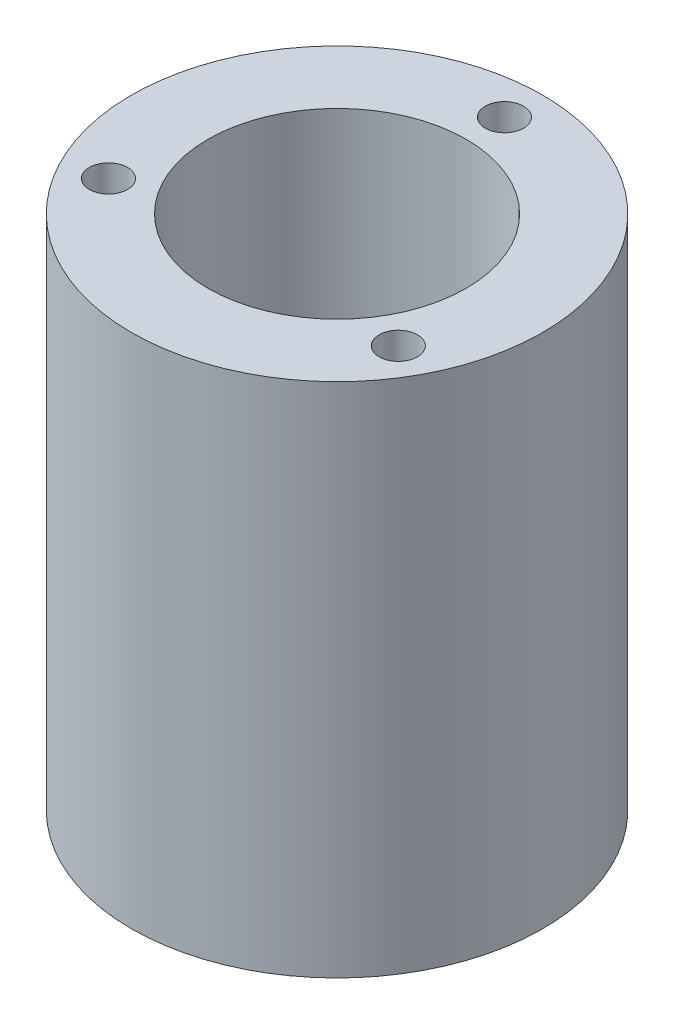
ISO-10303-21;
HEADER;
FILE_DESCRIPTION(('STEP AP214'),'2;1');
FILE_NAME('part.step','',(''),(''),'','','');
FILE_SCHEMA(('AUTOMOTIVE_DESIGN { 1 0 10303 214 1 1 1 1 }'));
ENDSEC;
DATA;
#1=APPLICATION_CONTEXT('core data for automotive mechanical design processes');
#2=APPLICATION_PROTOCOL_DEFINITION('international standard','automotive_design',2000,#1);
#3=PRODUCT_CONTEXT('',#1,'mechanical');
#4=PRODUCT('Part','Part','',(#3));
#5=PRODUCT_RELATED_PRODUCT_CATEGORY('part','',(#4));
#6=PRODUCT_DEFINITION_FORMATION('','',#4);
#7=PRODUCT_DEFINITION_CONTEXT('part definition',#1,'design');
#8=PRODUCT_DEFINITION('design','',#6,#7);
#9=PRODUCT_DEFINITION_SHAPE('','',#8);
#10=(LENGTH_UNIT() NAMED_UNIT(*) SI_UNIT(.MILLI.,.METRE.));
#11=(NAMED_UNIT(*) PLANE_ANGLE_UNIT() SI_UNIT($,.RADIAN.));
#12=(NAMED_UNIT(*) SI_UNIT($,.STERADIAN.) SOLID_ANGLE_UNIT());
#13=UNCERTAINTY_MEASURE_WITH_UNIT(LENGTH_MEASURE(1.E-05),#10,'distance_accuracy_value','');
#14=(GEOMETRIC_REPRESENTATION_CONTEXT(3) GLOBAL_UNCERTAINTY_ASSIGNED_CONTEXT((#13)) GLOBAL_UNIT_ASSIGNED_CONTEXT((#10,
#11,#12)) REPRESENTATION_CONTEXT('',''));
#15=CARTESIAN_POINT('',(0.,0.,0.));
#16=DIRECTION('',(0.,0.,1.));
#17=DIRECTION('',(1.,0.,0.));
#18=AXIS2_PLACEMENT_3D('',#15,#16,#17);
#19=CARTESIAN_POINT('',(0.,4.,0.));
#20=DIRECTION('',(0.,-1.,0.));
#21=DIRECTION('',(0.,0.,-1.));
#22=AXIS2_PLACEMENT_3D('',#19,#20,#21);
#23=CYLINDRICAL_SURFACE('',#22,21.5);
#24=CARTESIAN_POINT('',(0.,0.,0.));
#25=DIRECTION('',(0.,1.,0.));
#26=DIRECTION('',(0.,0.,1.));
#27=AXIS2_PLACEMENT_3D('',#24,#25,#26);
#28=CIRCLE('',#27,21.5);
#29=CARTESIAN_POINT('',(0.,0.,21.5));
#30=VERTEX_POINT('',#29);
#31=EDGE_CURVE('E47',#30,#30,#28,.T.);
#32=ORIENTED_EDGE('',*,*,#31,.T.);
#33=EDGE_LOOP('',(#32));
#34=FACE_BOUND('',#33,.T.);
#35=CARTESIAN_POINT('',(0.,54.,0.));
#36=DIRECTION('',(0.,1.,0.));
#37=DIRECTION('',(0.,0.,1.));
#38=AXIS2_PLACEMENT_3D('',#35,#36,#37);
#39=CIRCLE('',#38,21.5);
#40=CARTESIAN_POINT('',(0.,54.,21.5));
#41=VERTEX_POINT('',#40);
#42=EDGE_CURVE('E153',#41,#41,#39,.T.);
#43=ORIENTED_EDGE('',*,*,#42,.F.);
#44=EDGE_LOOP('',(#43));
#45=FACE_BOUND('',#44,.T.);
#46=ADVANCED_FACE('F39',(#34,#45),#23,.T.);
#47=CARTESIAN_POINT('',(0.,0.,0.));
#48=DIRECTION('',(0.,1.,0.));
#49=DIRECTION('',(0.,0.,1.));
#50=AXIS2_PLACEMENT_3D('',#47,#48,#49);
#51=PLANE('',#50);
#52=DIRECTION('',(1.,0.,0.));
#53=VECTOR('',#52,1.);
#54=CARTESIAN_POINT('',(-1.5,0.,-1.5));
#55=LINE('',#54,#53);
#56=CARTESIAN_POINT('',(-1.5,0.,-1.5));
#57=VERTEX_POINT('',#56);
#58=CARTESIAN_POINT('',(1.5,0.,-1.5));
#59=VERTEX_POINT('',#58);
#60=EDGE_CURVE('E104',#57,#59,#55,.T.);
#61=ORIENTED_EDGE('',*,*,#60,.F.);
#62=DIRECTION('',(0.,0.,-1.));
#63=VECTOR('',#62,1.);
#64=CARTESIAN_POINT('',(-1.5,0.,-1.5));
#65=LINE('',#64,#63);
#66=CARTESIAN_POINT('',(-1.5,0.,1.5));
#67=VERTEX_POINT('',#66);
#68=EDGE_CURVE('E54',#67,#57,#65,.T.);
#69=ORIENTED_EDGE('',*,*,#68,.F.);
#70=DIRECTION('',(-1.,0.,0.));
#71=VECTOR('',#70,1.);
#72=CARTESIAN_POINT('',(-1.5,0.,1.5));
#73=LINE('',#72,#71);
#74=CARTESIAN_POINT('',(1.5,0.,1.5));
#75=VERTEX_POINT('',#74);
#76=EDGE_CURVE('E94',#75,#67,#73,.T.);
#77=ORIENTED_EDGE('',*,*,#76,.F.);
#78=DIRECTION('',(0.,0.,1.));
#79=VECTOR('',#78,1.);
#80=CARTESIAN_POINT('',(1.5,0.,-1.5));
#81=LINE('',#80,#79);
#82=EDGE_CURVE('E112',#59,#75,#81,.T.);
#83=ORIENTED_EDGE('',*,*,#82,.F.);
#84=EDGE_LOOP('',(#61,#69,#77,#83));
#85=FACE_BOUND('',#84,.T.);
#86=ORIENTED_EDGE('',*,*,#31,.F.);
#87=EDGE_LOOP('',(#86));
#88=FACE_BOUND('',#87,.T.);
#89=ADVANCED_FACE('F162',(#85,#88),#51,.F.);
#90=CARTESIAN_POINT('',(0.,54.,0.));
#91=DIRECTION('',(0.,1.,0.));
#92=DIRECTION('',(0.,0.,1.));
#93=AXIS2_PLACEMENT_3D('',#90,#91,#92);
#94=PLANE('',#93);
#95=CARTESIAN_POINT('',(-15.1554445662276,54.,8.75000000000007));
#96=DIRECTION('',(0.,1.,0.));
#97=DIRECTION('',(0.866025403784436,0.,-0.500000000000004));
#98=AXIS2_PLACEMENT_3D('',#95,#96,#97);
#99=CIRCLE('',#98,2.);
#100=CARTESIAN_POINT('',(-13.4233937586588,54.,7.75000000000006));
#101=VERTEX_POINT('',#100);
#102=EDGE_CURVE('E131',#101,#101,#99,.T.);
#103=ORIENTED_EDGE('',*,*,#102,.F.);
#104=EDGE_LOOP('',(#103));
#105=FACE_BOUND('',#104,.T.);
#106=CARTESIAN_POINT('',(15.1554445662278,54.,8.74999999999986));
#107=DIRECTION('',(0.,1.,0.));
#108=DIRECTION('',(-0.866025403784443,0.,-0.499999999999992));
#109=AXIS2_PLACEMENT_3D('',#106,#107,#108);
#110=CIRCLE('',#109,2.);
#111=CARTESIAN_POINT('',(13.4233937586589,54.,7.74999999999988));
#112=VERTEX_POINT('',#111);
#113=EDGE_CURVE('E87',#112,#112,#110,.T.);
#114=ORIENTED_EDGE('',*,*,#113,.F.);
#115=EDGE_LOOP('',(#114));
#116=FACE_BOUND('',#115,.T.);
#117=CARTESIAN_POINT('',(0.,54.,-17.5));
#118=DIRECTION('',(0.,1.,0.));
#119=DIRECTION('',(0.,0.,1.));
#120=AXIS2_PLACEMENT_3D('',#117,#118,#119);
#121=CIRCLE('',#120,2.);
#122=CARTESIAN_POINT('',(0.,54.,-15.5));
#123=VERTEX_POINT('',#122);
#124=EDGE_CURVE('E130',#123,#123,#121,.T.);
#125=ORIENTED_EDGE('',*,*,#124,.F.);
#126=EDGE_LOOP('',(#125));
#127=FACE_BOUND('',#126,.T.);
#128=ORIENTED_EDGE('',*,*,#42,.T.);
#129=EDGE_LOOP('',(#128));
#130=FACE_BOUND('',#129,.T.);
#131=CARTESIAN_POINT('',(0.,54.,0.));
#132=DIRECTION('',(0.,1.,0.));
#133=DIRECTION('',(0.,0.,1.));
#134=AXIS2_PLACEMENT_3D('',#131,#132,#133);
#135=CIRCLE('',#134,13.5);
#136=CARTESIAN_POINT('',(0.,54.,13.5));
#137=VERTEX_POINT('',#136);
#138=EDGE_CURVE('E146',#137,#137,#135,.T.);
#139=ORIENTED_EDGE('',*,*,#138,.F.);
#140=EDGE_LOOP('',(#139));
#141=FACE_BOUND('',#140,.T.);
#142=ADVANCED_FACE('F164',(#105,#116,#127,#130,#141),#94,.T.);
#143=CARTESIAN_POINT('',(0.,54.,0.));
#144=DIRECTION('',(0.,-1.,0.));
#145=DIRECTION('',(0.,0.,-1.));
#146=AXIS2_PLACEMENT_3D('',#143,#144,#145);
#147=CYLINDRICAL_SURFACE('',#146,13.5);
#148=ORIENTED_EDGE('',*,*,#138,.T.);
#149=EDGE_LOOP('',(#148));
#150=FACE_BOUND('',#149,.T.);
#151=CARTESIAN_POINT('',(0.,4.,0.));
#152=DIRECTION('',(0.,1.,0.));
#153=DIRECTION('',(0.,0.,1.));
#154=AXIS2_PLACEMENT_3D('',#151,#152,#153);
#155=CIRCLE('',#154,13.5);
#156=CARTESIAN_POINT('',(0.,4.,13.5));
#157=VERTEX_POINT('',#156);
#158=EDGE_CURVE('E11',#157,#157,#155,.F.);
#159=ORIENTED_EDGE('',*,*,#158,.T.);
#160=EDGE_LOOP('',(#159));
#161=FACE_BOUND('',#160,.T.);
#162=ADVANCED_FACE('F170',(#150,#161),#147,.F.);
#163=CARTESIAN_POINT('',(0.,4.,0.));
#164=DIRECTION('',(0.,1.,0.));
#165=DIRECTION('',(0.,0.,1.));
#166=AXIS2_PLACEMENT_3D('',#163,#164,#165);
#167=PLANE('',#166);
#168=DIRECTION('',(0.,0.,-1.));
#169=VECTOR('',#168,1.);
#170=CARTESIAN_POINT('',(-1.5,4.,-1.5));
#171=LINE('',#170,#169);
#172=CARTESIAN_POINT('',(-1.5,4.,1.5));
#173=VERTEX_POINT('',#172);
#174=CARTESIAN_POINT('',(-1.5,4.,-1.5));
#175=VERTEX_POINT('',#174);
#176=EDGE_CURVE('E91',#173,#175,#171,.T.);
#177=ORIENTED_EDGE('',*,*,#176,.T.);
#178=DIRECTION('',(1.,0.,0.));
#179=VECTOR('',#178,1.);
#180=CARTESIAN_POINT('',(-1.5,4.,-1.5));
#181=LINE('',#180,#179);
#182=CARTESIAN_POINT('',(1.5,4.,-1.5));
#183=VERTEX_POINT('',#182);
#184=EDGE_CURVE('E79',#175,#183,#181,.T.);
#185=ORIENTED_EDGE('',*,*,#184,.T.);
#186=DIRECTION('',(0.,0.,1.));
#187=VECTOR('',#186,1.);
#188=CARTESIAN_POINT('',(1.5,4.,-1.5));
#189=LINE('',#188,#187);
#190=CARTESIAN_POINT('',(1.5,4.,1.5));
#191=VERTEX_POINT('',#190);
#192=EDGE_CURVE('E106',#183,#191,#189,.T.);
#193=ORIENTED_EDGE('',*,*,#192,.T.);
#194=DIRECTION('',(-1.,0.,0.));
#195=VECTOR('',#194,1.);
#196=CARTESIAN_POINT('',(-1.5,4.,1.5));
#197=LINE('',#196,#195);
#198=EDGE_CURVE('E99',#191,#173,#197,.T.);
#199=ORIENTED_EDGE('',*,*,#198,.T.);
#200=EDGE_LOOP('',(#177,#185,#193,#199));
#201=FACE_BOUND('',#200,.T.);
#202=ORIENTED_EDGE('',*,*,#158,.F.);
#203=EDGE_LOOP('',(#202));
#204=FACE_BOUND('',#203,.T.);
#205=ADVANCED_FACE('F97',(#201,#204),#167,.T.);
#206=CARTESIAN_POINT('',(0.,48.,-17.5));
#207=DIRECTION('',(0.,1.,0.));
#208=DIRECTION('',(0.,0.,1.));
#209=AXIS2_PLACEMENT_3D('',#206,#207,#208);
#210=CYLINDRICAL_SURFACE('',#209,2.);
#211=CARTESIAN_POINT('',(0.,48.,-17.5));
#212=DIRECTION('',(0.,1.,0.));
#213=DIRECTION('',(0.,0.,1.));
#214=AXIS2_PLACEMENT_3D('',#211,#212,#213);
#215=CIRCLE('',#214,2.);
#216=CARTESIAN_POINT('',(0.,48.,-15.5));
#217=VERTEX_POINT('',#216);
#218=EDGE_CURVE('E142',#217,#217,#215,.T.);
#219=ORIENTED_EDGE('',*,*,#218,.F.);
#220=EDGE_LOOP('',(#219));
#221=FACE_BOUND('',#220,.T.);
#222=ORIENTED_EDGE('',*,*,#124,.T.);
#223=EDGE_LOOP('',(#222));
#224=FACE_BOUND('',#223,.T.);
#225=ADVANCED_FACE('F175',(#221,#224),#210,.F.);
#226=CARTESIAN_POINT('',(0.,48.,-17.5));
#227=DIRECTION('',(0.,1.,0.));
#228=DIRECTION('',(0.,0.,1.));
#229=AXIS2_PLACEMENT_3D('',#226,#227,#228);
#230=PLANE('',#229);
#231=ORIENTED_EDGE('',*,*,#218,.T.);
#232=EDGE_LOOP('',(#231));
#233=FACE_BOUND('',#232,.T.);
#234=ADVANCED_FACE('F182',(#233),#230,.T.);
#235=CARTESIAN_POINT('',(15.1554445662278,48.,8.74999999999986));
#236=DIRECTION('',(0.,1.,0.));
#237=DIRECTION('',(0.,0.,1.));
#238=AXIS2_PLACEMENT_3D('',#235,#236,#237);
#239=CYLINDRICAL_SURFACE('',#238,2.);
#240=CARTESIAN_POINT('',(15.1554445662278,48.,8.74999999999986));
#241=DIRECTION('',(0.,1.,0.));
#242=DIRECTION('',(-0.866025403784443,0.,-0.499999999999992));
#243=AXIS2_PLACEMENT_3D('',#240,#241,#242);
#244=CIRCLE('',#243,2.);
#245=CARTESIAN_POINT('',(13.4233937586589,48.,7.74999999999988));
#246=VERTEX_POINT('',#245);
#247=EDGE_CURVE('E135',#246,#246,#244,.T.);
#248=ORIENTED_EDGE('',*,*,#247,.F.);
#249=EDGE_LOOP('',(#248));
#250=FACE_BOUND('',#249,.T.);
#251=ORIENTED_EDGE('',*,*,#113,.T.);
#252=EDGE_LOOP('',(#251));
#253=FACE_BOUND('',#252,.T.);
#254=ADVANCED_FACE('F186',(#250,#253),#239,.F.);
#255=CARTESIAN_POINT('',(15.1554445662278,48.,8.74999999999986));
#256=DIRECTION('',(0.,1.,0.));
#257=DIRECTION('',(-0.866025403784443,0.,-0.499999999999992));
#258=AXIS2_PLACEMENT_3D('',#255,#256,#257);
#259=PLANE('',#258);
#260=ORIENTED_EDGE('',*,*,#247,.T.);
#261=EDGE_LOOP('',(#260));
#262=FACE_BOUND('',#261,.T.);
#263=ADVANCED_FACE('F190',(#262),#259,.T.);
#264=CARTESIAN_POINT('',(-15.1554445662276,48.,8.75000000000007));
#265=DIRECTION('',(0.,1.,0.));
#266=DIRECTION('',(0.,0.,1.));
#267=AXIS2_PLACEMENT_3D('',#264,#265,#266);
#268=CYLINDRICAL_SURFACE('',#267,2.);
#269=CARTESIAN_POINT('',(-15.1554445662276,48.,8.75000000000007));
#270=DIRECTION('',(0.,1.,0.));
#271=DIRECTION('',(0.866025403784436,0.,-0.500000000000004));
#272=AXIS2_PLACEMENT_3D('',#269,#270,#271);
#273=CIRCLE('',#272,2.);
#274=CARTESIAN_POINT('',(-13.4233937586588,48.,7.75000000000006));
#275=VERTEX_POINT('',#274);
#276=EDGE_CURVE('E126',#275,#275,#273,.T.);
#277=ORIENTED_EDGE('',*,*,#276,.F.);
#278=EDGE_LOOP('',(#277));
#279=FACE_BOUND('',#278,.T.);
#280=ORIENTED_EDGE('',*,*,#102,.T.);
#281=EDGE_LOOP('',(#280));
#282=FACE_BOUND('',#281,.T.);
#283=ADVANCED_FACE('F194',(#279,#282),#268,.F.);
#284=CARTESIAN_POINT('',(-15.1554445662276,48.,8.75000000000007));
#285=DIRECTION('',(0.,1.,0.));
#286=DIRECTION('',(0.866025403784436,0.,-0.500000000000004));
#287=AXIS2_PLACEMENT_3D('',#284,#285,#286);
#288=PLANE('',#287);
#289=ORIENTED_EDGE('',*,*,#276,.T.);
#290=EDGE_LOOP('',(#289));
#291=FACE_BOUND('',#290,.T.);
#292=ADVANCED_FACE('F198',(#291),#288,.T.);
#293=CARTESIAN_POINT('',(-1.5,54.001,-1.5));
#294=DIRECTION('',(-1.,0.,0.));
#295=DIRECTION('',(0.,0.,1.));
#296=AXIS2_PLACEMENT_3D('',#293,#294,#295);
#297=PLANE('',#296);
#298=DIRECTION('',(0.,-1.,0.));
#299=VECTOR('',#298,1.);
#300=CARTESIAN_POINT('',(-1.5,54.001,1.5));
#301=LINE('',#300,#299);
#302=EDGE_CURVE('E88',#173,#67,#301,.T.);
#303=ORIENTED_EDGE('',*,*,#302,.T.);
#304=ORIENTED_EDGE('',*,*,#68,.T.);
#305=DIRECTION('',(0.,-1.,0.));
#306=VECTOR('',#305,1.);
#307=CARTESIAN_POINT('',(-1.5,54.001,-1.5));
#308=LINE('',#307,#306);
#309=EDGE_CURVE('E81',#175,#57,#308,.T.);
#310=ORIENTED_EDGE('',*,*,#309,.F.);
#311=ORIENTED_EDGE('',*,*,#176,.F.);
#312=EDGE_LOOP('',(#303,#304,#310,#311));
#313=FACE_BOUND('',#312,.T.);
#314=ADVANCED_FACE('F90',(#313),#297,.F.);
#315=CARTESIAN_POINT('',(-1.5,54.001,1.5));
#316=DIRECTION('',(0.,0.,1.));
#317=DIRECTION('',(1.,0.,0.));
#318=AXIS2_PLACEMENT_3D('',#315,#316,#317);
#319=PLANE('',#318);
#320=DIRECTION('',(0.,-1.,0.));
#321=VECTOR('',#320,1.);
#322=CARTESIAN_POINT('',(1.5,54.001,1.5));
#323=LINE('',#322,#321);
#324=EDGE_CURVE('E121',#191,#75,#323,.T.);
#325=ORIENTED_EDGE('',*,*,#324,.T.);
#326=ORIENTED_EDGE('',*,*,#76,.T.);
#327=ORIENTED_EDGE('',*,*,#302,.F.);
#328=ORIENTED_EDGE('',*,*,#198,.F.);
#329=EDGE_LOOP('',(#325,#326,#327,#328));
#330=FACE_BOUND('',#329,.T.);
#331=ADVANCED_FACE('F205',(#330),#319,.F.);
#332=CARTESIAN_POINT('',(1.5,54.001,-1.5));
#333=DIRECTION('',(1.,0.,0.));
#334=DIRECTION('',(0.,0.,-1.));
#335=AXIS2_PLACEMENT_3D('',#332,#333,#334);
#336=PLANE('',#335);
#337=DIRECTION('',(0.,-1.,0.));
#338=VECTOR('',#337,1.);
#339=CARTESIAN_POINT('',(1.5,54.001,-1.5));
#340=LINE('',#339,#338);
#341=EDGE_CURVE('E62',#183,#59,#340,.T.);
#342=ORIENTED_EDGE('',*,*,#341,.T.);
#343=ORIENTED_EDGE('',*,*,#82,.T.);
#344=ORIENTED_EDGE('',*,*,#324,.F.);
#345=ORIENTED_EDGE('',*,*,#192,.F.);
#346=EDGE_LOOP('',(#342,#343,#344,#345));
#347=FACE_BOUND('',#346,.T.);
#348=ADVANCED_FACE('F208',(#347),#336,.F.);
#349=CARTESIAN_POINT('',(-1.5,54.001,-1.5));
#350=DIRECTION('',(0.,0.,-1.));
#351=DIRECTION('',(-1.,0.,0.));
#352=AXIS2_PLACEMENT_3D('',#349,#350,#351);
#353=PLANE('',#352);
#354=ORIENTED_EDGE('',*,*,#309,.T.);
#355=ORIENTED_EDGE('',*,*,#60,.T.);
#356=ORIENTED_EDGE('',*,*,#341,.F.);
#357=ORIENTED_EDGE('',*,*,#184,.F.);
#358=EDGE_LOOP('',(#354,#355,#356,#357));
#359=FACE_BOUND('',#358,.T.);
#360=ADVANCED_FACE('F80',(#359),#353,.F.);
#361=CLOSED_SHELL('',(#46,#89,#142,#162,#205,#225,#234,#254,#263,#283,#292,#314,#331,#348,#360));
#362=MANIFOLD_SOLID_BREP('B2',#361);
#363=ADVANCED_BREP_SHAPE_REPRESENTATION('',(#18,#362),#14);
#364=SHAPE_DEFINITION_REPRESENTATION(#9,#363);
ENDSEC;
END-ISO-10303-21;
